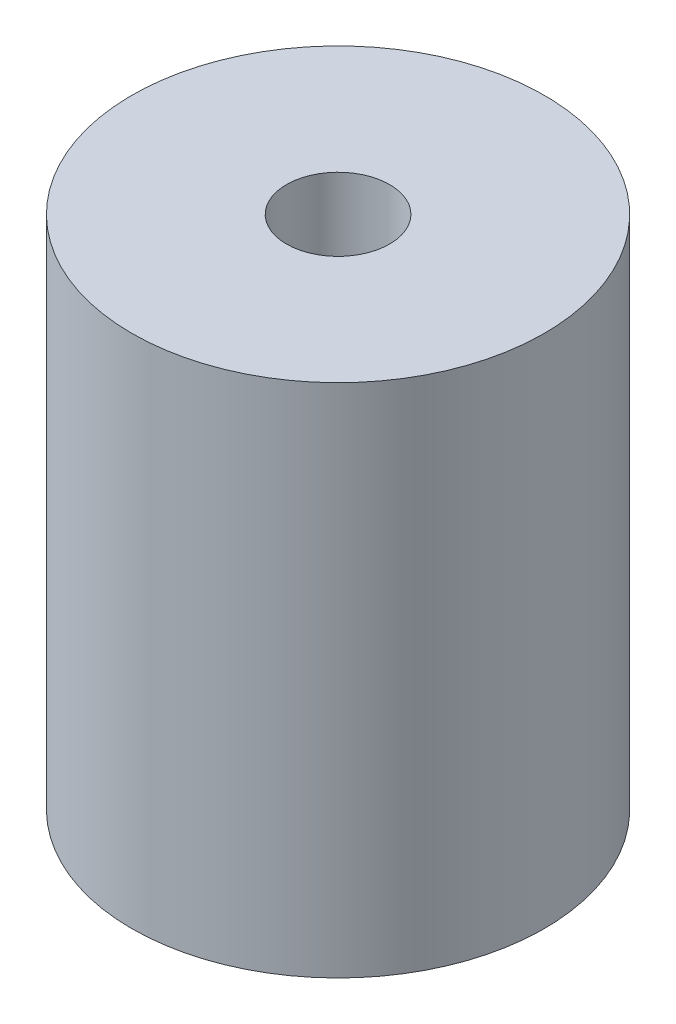
ISO-10303-21;
HEADER;
FILE_DESCRIPTION(('STEP AP214'),'2;1');
FILE_NAME('part.step','',(''),(''),'','','');
FILE_SCHEMA(('AUTOMOTIVE_DESIGN { 1 0 10303 214 1 1 1 1 }'));
ENDSEC;
DATA;
#1=APPLICATION_CONTEXT('core data for automotive mechanical design processes');
#2=APPLICATION_PROTOCOL_DEFINITION('international standard','automotive_design',2000,#1);
#3=PRODUCT_CONTEXT('',#1,'mechanical');
#4=PRODUCT('Part','Part','',(#3));
#5=PRODUCT_RELATED_PRODUCT_CATEGORY('part','',(#4));
#6=PRODUCT_DEFINITION_FORMATION('','',#4);
#7=PRODUCT_DEFINITION_CONTEXT('part definition',#1,'design');
#8=PRODUCT_DEFINITION('design','',#6,#7);
#9=PRODUCT_DEFINITION_SHAPE('','',#8);
#10=(LENGTH_UNIT() NAMED_UNIT(*) SI_UNIT(.MILLI.,.METRE.));
#11=(NAMED_UNIT(*) PLANE_ANGLE_UNIT() SI_UNIT($,.RADIAN.));
#12=(NAMED_UNIT(*) SI_UNIT($,.STERADIAN.) SOLID_ANGLE_UNIT());
#13=UNCERTAINTY_MEASURE_WITH_UNIT(LENGTH_MEASURE(1.E-05),#10,'distance_accuracy_value','');
#14=(GEOMETRIC_REPRESENTATION_CONTEXT(3) GLOBAL_UNCERTAINTY_ASSIGNED_CONTEXT((#13)) GLOBAL_UNIT_ASSIGNED_CONTEXT((#10,
#11,#12)) REPRESENTATION_CONTEXT('',''));
#15=CARTESIAN_POINT('',(0.,0.,0.));
#16=DIRECTION('',(0.,0.,1.));
#17=DIRECTION('',(1.,0.,0.));
#18=AXIS2_PLACEMENT_3D('',#15,#16,#17);
#19=CARTESIAN_POINT('',(0.,25.,0.));
#20=DIRECTION('',(0.,-1.,0.));
#21=DIRECTION('',(0.,0.,-1.));
#22=AXIS2_PLACEMENT_3D('',#19,#20,#21);
#23=CYLINDRICAL_SURFACE('',#22,10.);
#24=CARTESIAN_POINT('',(0.,25.,0.));
#25=DIRECTION('',(0.,1.,0.));
#26=DIRECTION('',(0.,0.,1.));
#27=AXIS2_PLACEMENT_3D('',#24,#25,#26);
#28=CIRCLE('',#27,10.);
#29=CARTESIAN_POINT('',(0.,25.,10.));
#30=VERTEX_POINT('',#29);
#31=EDGE_CURVE('E10',#30,#30,#28,.T.);
#32=ORIENTED_EDGE('',*,*,#31,.F.);
#33=EDGE_LOOP('',(#32));
#34=FACE_BOUND('',#33,.T.);
#35=CARTESIAN_POINT('',(0.,0.,0.));
#36=DIRECTION('',(0.,1.,0.));
#37=DIRECTION('',(0.,0.,1.));
#38=AXIS2_PLACEMENT_3D('',#35,#36,#37);
#39=CIRCLE('',#38,10.);
#40=CARTESIAN_POINT('',(0.,0.,10.));
#41=VERTEX_POINT('',#40);
#42=EDGE_CURVE('E40',#41,#41,#39,.T.);
#43=ORIENTED_EDGE('',*,*,#42,.T.);
#44=EDGE_LOOP('',(#43));
#45=FACE_BOUND('',#44,.T.);
#46=ADVANCED_FACE('F37',(#34,#45),#23,.T.);
#47=CARTESIAN_POINT('',(0.,25.,0.));
#48=DIRECTION('',(0.,1.,0.));
#49=DIRECTION('',(0.,0.,1.));
#50=AXIS2_PLACEMENT_3D('',#47,#48,#49);
#51=PLANE('',#50);
#52=CARTESIAN_POINT('',(0.,25.,0.));
#53=DIRECTION('',(0.,1.,0.));
#54=DIRECTION('',(0.,0.,1.));
#55=AXIS2_PLACEMENT_3D('',#52,#53,#54);
#56=CIRCLE('',#55,2.50000000000001);
#57=CARTESIAN_POINT('',(0.,25.,2.50000000000001));
#58=VERTEX_POINT('',#57);
#59=EDGE_CURVE('E47',#58,#58,#56,.T.);
#60=ORIENTED_EDGE('',*,*,#59,.F.);
#61=EDGE_LOOP('',(#60));
#62=FACE_BOUND('',#61,.T.);
#63=ORIENTED_EDGE('',*,*,#31,.T.);
#64=EDGE_LOOP('',(#63));
#65=FACE_BOUND('',#64,.T.);
#66=ADVANCED_FACE('F67',(#62,#65),#51,.T.);
#67=CARTESIAN_POINT('',(0.,0.,0.));
#68=DIRECTION('',(0.,1.,0.));
#69=DIRECTION('',(0.,0.,1.));
#70=AXIS2_PLACEMENT_3D('',#67,#68,#69);
#71=PLANE('',#70);
#72=CARTESIAN_POINT('',(0.,0.,0.));
#73=DIRECTION('',(0.,-1.,0.));
#74=DIRECTION('',(0.,0.,-1.));
#75=AXIS2_PLACEMENT_3D('',#72,#73,#74);
#76=CIRCLE('',#75,4.00000000000001);
#77=CARTESIAN_POINT('',(0.,0.,-4.00000000000001));
#78=VERTEX_POINT('',#77);
#79=EDGE_CURVE('E57',#78,#78,#76,.T.);
#80=ORIENTED_EDGE('',*,*,#79,.F.);
#81=EDGE_LOOP('',(#80));
#82=FACE_BOUND('',#81,.T.);
#83=ORIENTED_EDGE('',*,*,#42,.F.);
#84=EDGE_LOOP('',(#83));
#85=FACE_BOUND('',#84,.T.);
#86=ADVANCED_FACE('F63',(#82,#85),#71,.F.);
#87=CARTESIAN_POINT('',(0.,25.,0.));
#88=DIRECTION('',(0.,1.,0.));
#89=DIRECTION('',(0.,0.,1.));
#90=AXIS2_PLACEMENT_3D('',#87,#88,#89);
#91=CYLINDRICAL_SURFACE('',#90,2.50000000000001);
#92=CARTESIAN_POINT('',(0.,12.5,0.));
#93=DIRECTION('',(0.,1.,0.));
#94=DIRECTION('',(0.,0.,1.));
#95=AXIS2_PLACEMENT_3D('',#92,#93,#94);
#96=CIRCLE('',#95,2.50000000000001);
#97=CARTESIAN_POINT('',(0.,12.5,2.50000000000001));
#98=VERTEX_POINT('',#97);
#99=EDGE_CURVE('E51',#98,#98,#96,.F.);
#100=ORIENTED_EDGE('',*,*,#99,.T.);
#101=EDGE_LOOP('',(#100));
#102=FACE_BOUND('',#101,.T.);
#103=ORIENTED_EDGE('',*,*,#59,.T.);
#104=EDGE_LOOP('',(#103));
#105=FACE_BOUND('',#104,.T.);
#106=ADVANCED_FACE('F66',(#102,#105),#91,.F.);
#107=CARTESIAN_POINT('',(0.,12.5,0.));
#108=DIRECTION('',(0.,1.,0.));
#109=DIRECTION('',(0.,0.,1.));
#110=AXIS2_PLACEMENT_3D('',#107,#108,#109);
#111=PLANE('',#110);
#112=CARTESIAN_POINT('',(0.,12.5,0.));
#113=DIRECTION('',(0.,-1.,0.));
#114=DIRECTION('',(0.,0.,-1.));
#115=AXIS2_PLACEMENT_3D('',#112,#113,#114);
#116=CIRCLE('',#115,4.00000000000001);
#117=CARTESIAN_POINT('',(0.,12.5,-4.00000000000001));
#118=VERTEX_POINT('',#117);
#119=EDGE_CURVE('E54',#118,#118,#116,.T.);
#120=ORIENTED_EDGE('',*,*,#119,.T.);
#121=EDGE_LOOP('',(#120));
#122=FACE_BOUND('',#121,.T.);
#123=ORIENTED_EDGE('',*,*,#99,.F.);
#124=EDGE_LOOP('',(#123));
#125=FACE_BOUND('',#124,.T.);
#126=ADVANCED_FACE('F83',(#122,#125),#111,.F.);
#127=CARTESIAN_POINT('',(0.,0.,0.));
#128=DIRECTION('',(0.,-1.,0.));
#129=DIRECTION('',(0.,0.,-1.));
#130=AXIS2_PLACEMENT_3D('',#127,#128,#129);
#131=CYLINDRICAL_SURFACE('',#130,4.00000000000001);
#132=ORIENTED_EDGE('',*,*,#119,.F.);
#133=EDGE_LOOP('',(#132));
#134=FACE_BOUND('',#133,.T.);
#135=ORIENTED_EDGE('',*,*,#79,.T.);
#136=EDGE_LOOP('',(#135));
#137=FACE_BOUND('',#136,.T.);
#138=ADVANCED_FACE('F61',(#134,#137),#131,.F.);
#139=CLOSED_SHELL('',(#46,#66,#86,#106,#126,#138));
#140=MANIFOLD_SOLID_BREP('B2',#139);
#141=ADVANCED_BREP_SHAPE_REPRESENTATION('',(#18,#140),#14);
#142=SHAPE_DEFINITION_REPRESENTATION(#9,#141);
ENDSEC;
END-ISO-10303-21;
